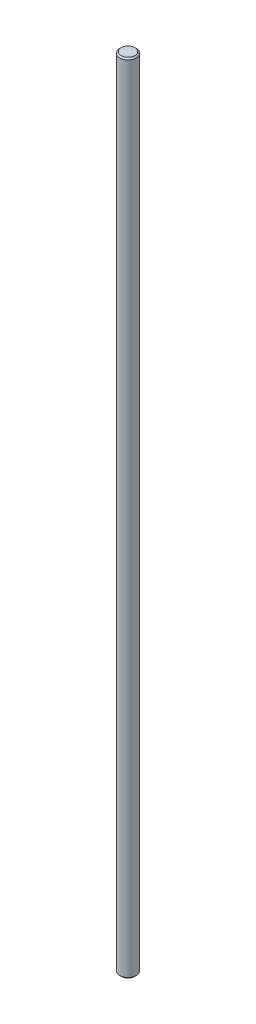
ISO-10303-21;
HEADER;
FILE_DESCRIPTION(('STEP AP214'),'2;1');
FILE_NAME('part.step','',(''),(''),'','','');
FILE_SCHEMA(('AUTOMOTIVE_DESIGN { 1 0 10303 214 1 1 1 1 }'));
ENDSEC;
DATA;
#1=APPLICATION_CONTEXT('core data for automotive mechanical design processes');
#2=APPLICATION_PROTOCOL_DEFINITION('international standard','automotive_design',2000,#1);
#3=PRODUCT_CONTEXT('',#1,'mechanical');
#4=PRODUCT('Part','Part','',(#3));
#5=PRODUCT_RELATED_PRODUCT_CATEGORY('part','',(#4));
#6=PRODUCT_DEFINITION_FORMATION('','',#4);
#7=PRODUCT_DEFINITION_CONTEXT('part definition',#1,'design');
#8=PRODUCT_DEFINITION('design','',#6,#7);
#9=PRODUCT_DEFINITION_SHAPE('','',#8);
#10=(LENGTH_UNIT() NAMED_UNIT(*) SI_UNIT(.MILLI.,.METRE.));
#11=(NAMED_UNIT(*) PLANE_ANGLE_UNIT() SI_UNIT($,.RADIAN.));
#12=(NAMED_UNIT(*) SI_UNIT($,.STERADIAN.) SOLID_ANGLE_UNIT());
#13=UNCERTAINTY_MEASURE_WITH_UNIT(LENGTH_MEASURE(1.E-05),#10,'distance_accuracy_value','');
#14=(GEOMETRIC_REPRESENTATION_CONTEXT(3) GLOBAL_UNCERTAINTY_ASSIGNED_CONTEXT((#13)) GLOBAL_UNIT_ASSIGNED_CONTEXT((#10,
#11,#12)) REPRESENTATION_CONTEXT('',''));
#15=CARTESIAN_POINT('',(0.,0.,0.));
#16=DIRECTION('',(0.,0.,1.));
#17=DIRECTION('',(1.,0.,0.));
#18=AXIS2_PLACEMENT_3D('',#15,#16,#17);
#19=CARTESIAN_POINT('',(0.,-144.5,0.));
#20=DIRECTION('',(0.,1.,0.));
#21=DIRECTION('',(1.,0.,0.));
#22=AXIS2_PLACEMENT_3D('',#19,#20,#21);
#23=PLANE('',#22);
#24=CARTESIAN_POINT('',(0.,-144.5,0.));
#25=DIRECTION('',(0.,-1.,0.));
#26=DIRECTION('',(1.,0.,0.));
#27=AXIS2_PLACEMENT_3D('',#24,#25,#26);
#28=CIRCLE('',#27,2.5);
#29=CARTESIAN_POINT('',(2.5,-144.5,0.));
#30=VERTEX_POINT('',#29);
#31=EDGE_CURVE('E10',#30,#30,#28,.T.);
#32=ORIENTED_EDGE('',*,*,#31,.T.);
#33=EDGE_LOOP('',(#32));
#34=FACE_BOUND('',#33,.T.);
#35=ADVANCED_FACE('F15',(#34),#23,.F.);
#36=CARTESIAN_POINT('',(0.,-144.2500000029,0.));
#37=DIRECTION('',(0.,1.,0.));
#38=DIRECTION('',(0.,0.,-1.));
#39=AXIS2_PLACEMENT_3D('',#36,#37,#38);
#40=CONICAL_SURFACE('',#39,2.749999997072,0.7853981633973);
#41=CARTESIAN_POINT('',(0.,-144.,0.));
#42=DIRECTION('',(0.,-1.,0.));
#43=DIRECTION('',(-1.,0.,0.));
#44=AXIS2_PLACEMENT_3D('',#41,#42,#43);
#45=CIRCLE('',#44,3.);
#46=CARTESIAN_POINT('',(-3.,-144.,0.));
#47=VERTEX_POINT('',#46);
#48=EDGE_CURVE('E23',#47,#47,#45,.T.);
#49=ORIENTED_EDGE('',*,*,#48,.T.);
#50=EDGE_LOOP('',(#49));
#51=FACE_BOUND('',#50,.T.);
#52=ORIENTED_EDGE('',*,*,#31,.F.);
#53=EDGE_LOOP('',(#52));
#54=FACE_BOUND('',#53,.T.);
#55=ADVANCED_FACE('F45',(#51,#54),#40,.T.);
#56=CARTESIAN_POINT('',(0.,-144.5,0.));
#57=DIRECTION('',(0.,1.,0.));
#58=DIRECTION('',(1.,0.,0.));
#59=AXIS2_PLACEMENT_3D('',#56,#57,#58);
#60=CYLINDRICAL_SURFACE('',#59,3.);
#61=CARTESIAN_POINT('',(0.,144.,0.));
#62=DIRECTION('',(0.,1.,0.));
#63=DIRECTION('',(-1.,0.,0.));
#64=AXIS2_PLACEMENT_3D('',#61,#62,#63);
#65=CIRCLE('',#64,3.);
#66=CARTESIAN_POINT('',(-3.,144.,0.));
#67=VERTEX_POINT('',#66);
#68=EDGE_CURVE('E28',#67,#67,#65,.T.);
#69=ORIENTED_EDGE('',*,*,#68,.F.);
#70=EDGE_LOOP('',(#69));
#71=FACE_BOUND('',#70,.T.);
#72=ORIENTED_EDGE('',*,*,#48,.F.);
#73=EDGE_LOOP('',(#72));
#74=FACE_BOUND('',#73,.T.);
#75=ADVANCED_FACE('F39',(#71,#74),#60,.T.);
#76=CARTESIAN_POINT('',(0.,144.2500000029,0.));
#77=DIRECTION('',(0.,-1.,0.));
#78=DIRECTION('',(0.,0.,-1.));
#79=AXIS2_PLACEMENT_3D('',#76,#77,#78);
#80=CONICAL_SURFACE('',#79,2.749999997072,0.7853981633973);
#81=ORIENTED_EDGE('',*,*,#68,.T.);
#82=EDGE_LOOP('',(#81));
#83=FACE_BOUND('',#82,.T.);
#84=CARTESIAN_POINT('',(0.,144.5,0.));
#85=DIRECTION('',(0.,1.,0.));
#86=DIRECTION('',(-1.,0.,0.));
#87=AXIS2_PLACEMENT_3D('',#84,#85,#86);
#88=CIRCLE('',#87,2.5);
#89=CARTESIAN_POINT('',(-2.5,144.5,0.));
#90=VERTEX_POINT('',#89);
#91=EDGE_CURVE('E19',#90,#90,#88,.T.);
#92=ORIENTED_EDGE('',*,*,#91,.F.);
#93=EDGE_LOOP('',(#92));
#94=FACE_BOUND('',#93,.T.);
#95=ADVANCED_FACE('F37',(#83,#94),#80,.T.);
#96=CARTESIAN_POINT('',(0.,144.5,0.));
#97=DIRECTION('',(0.,1.,0.));
#98=DIRECTION('',(1.,0.,0.));
#99=AXIS2_PLACEMENT_3D('',#96,#97,#98);
#100=PLANE('',#99);
#101=ORIENTED_EDGE('',*,*,#91,.T.);
#102=EDGE_LOOP('',(#101));
#103=FACE_BOUND('',#102,.T.);
#104=ADVANCED_FACE('F17',(#103),#100,.T.);
#105=CLOSED_SHELL('',(#35,#55,#75,#95,#104));
#106=MANIFOLD_SOLID_BREP('B1',#105);
#107=ADVANCED_BREP_SHAPE_REPRESENTATION('',(#18,#106),#14);
#108=SHAPE_DEFINITION_REPRESENTATION(#9,#107);
ENDSEC;
END-ISO-10303-21;
